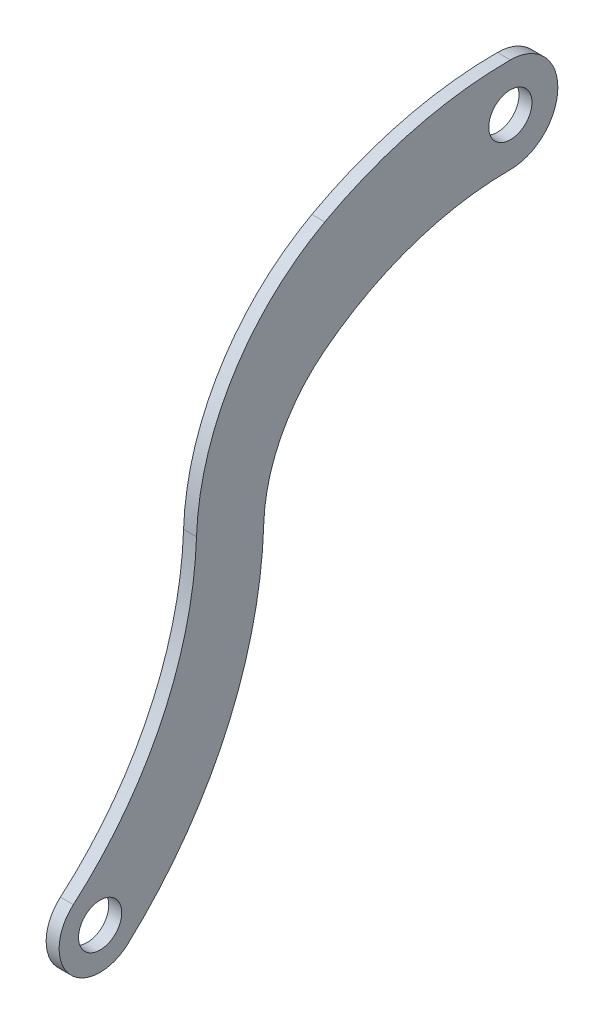
ISO-10303-21;
HEADER;
FILE_DESCRIPTION(('STEP AP214'),'2;1');
FILE_NAME('part.step','',(''),(''),'','','');
FILE_SCHEMA(('AUTOMOTIVE_DESIGN { 1 0 10303 214 1 1 1 1 }'));
ENDSEC;
DATA;
#1=APPLICATION_CONTEXT('core data for automotive mechanical design processes');
#2=APPLICATION_PROTOCOL_DEFINITION('international standard','automotive_design',2000,#1);
#3=PRODUCT_CONTEXT('',#1,'mechanical');
#4=PRODUCT('Part','Part','',(#3));
#5=PRODUCT_RELATED_PRODUCT_CATEGORY('part','',(#4));
#6=PRODUCT_DEFINITION_FORMATION('','',#4);
#7=PRODUCT_DEFINITION_CONTEXT('part definition',#1,'design');
#8=PRODUCT_DEFINITION('design','',#6,#7);
#9=PRODUCT_DEFINITION_SHAPE('','',#8);
#10=(LENGTH_UNIT() NAMED_UNIT(*) SI_UNIT(.MILLI.,.METRE.));
#11=(NAMED_UNIT(*) PLANE_ANGLE_UNIT() SI_UNIT($,.RADIAN.));
#12=(NAMED_UNIT(*) SI_UNIT($,.STERADIAN.) SOLID_ANGLE_UNIT());
#13=UNCERTAINTY_MEASURE_WITH_UNIT(LENGTH_MEASURE(1.E-05),#10,'distance_accuracy_value','');
#14=(GEOMETRIC_REPRESENTATION_CONTEXT(3) GLOBAL_UNCERTAINTY_ASSIGNED_CONTEXT((#13)) GLOBAL_UNIT_ASSIGNED_CONTEXT((#10,
#11,#12)) REPRESENTATION_CONTEXT('',''));
#15=CARTESIAN_POINT('',(0.,0.,0.));
#16=DIRECTION('',(0.,0.,1.));
#17=DIRECTION('',(1.,0.,0.));
#18=AXIS2_PLACEMENT_3D('',#15,#16,#17);
#19=CARTESIAN_POINT('',(1.5,9.00000000000001,0.));
#20=DIRECTION('',(-1.,0.,0.));
#21=DIRECTION('',(0.,0.,1.));
#22=AXIS2_PLACEMENT_3D('',#19,#20,#21);
#23=CYLINDRICAL_SURFACE('',#22,70.);
#24=CARTESIAN_POINT('',(-1.5,9.00000000000001,0.));
#25=DIRECTION('',(-1.,0.,0.));
#26=DIRECTION('',(0.,0.,-1.));
#27=AXIS2_PLACEMENT_3D('',#24,#25,#26);
#28=CIRCLE('',#27,70.);
#29=CARTESIAN_POINT('',(-1.5,64.2633835994058,42.9646183870511));
#30=VERTEX_POINT('',#29);
#31=CARTESIAN_POINT('',(-1.5,79.,0.));
#32=VERTEX_POINT('',#31);
#33=EDGE_CURVE('E133',#30,#32,#28,.T.);
#34=ORIENTED_EDGE('',*,*,#33,.T.);
#35=DIRECTION('',(-1.,0.,0.));
#36=VECTOR('',#35,1.);
#37=CARTESIAN_POINT('',(1.5,79.,0.));
#38=LINE('',#37,#36);
#39=CARTESIAN_POINT('',(1.5,79.,0.));
#40=VERTEX_POINT('',#39);
#41=EDGE_CURVE('E11',#40,#32,#38,.T.);
#42=ORIENTED_EDGE('',*,*,#41,.F.);
#43=CARTESIAN_POINT('',(1.5,9.00000000000001,0.));
#44=DIRECTION('',(-1.,0.,0.));
#45=DIRECTION('',(0.,0.,-1.));
#46=AXIS2_PLACEMENT_3D('',#43,#44,#45);
#47=CIRCLE('',#46,70.);
#48=CARTESIAN_POINT('',(1.5,64.2633835994058,42.9646183870511));
#49=VERTEX_POINT('',#48);
#50=EDGE_CURVE('E148',#49,#40,#47,.T.);
#51=ORIENTED_EDGE('',*,*,#50,.F.);
#52=DIRECTION('',(-1.,0.,0.));
#53=VECTOR('',#52,1.);
#54=CARTESIAN_POINT('',(1.5,64.2633835994058,42.9646183870511));
#55=LINE('',#54,#53);
#56=EDGE_CURVE('E129',#49,#30,#55,.T.);
#57=ORIENTED_EDGE('',*,*,#56,.T.);
#58=EDGE_LOOP('',(#34,#42,#51,#57));
#59=FACE_BOUND('',#58,.T.);
#60=ADVANCED_FACE('F37',(#59),#23,.F.);
#61=CARTESIAN_POINT('',(1.5,90.,0.));
#62=DIRECTION('',(-1.,0.,0.));
#63=DIRECTION('',(0.,0.,1.));
#64=AXIS2_PLACEMENT_3D('',#61,#62,#63);
#65=CYLINDRICAL_SURFACE('',#64,11.);
#66=CARTESIAN_POINT('',(-1.5,90.,0.));
#67=DIRECTION('',(1.,0.,0.));
#68=DIRECTION('',(0.,0.,-1.));
#69=AXIS2_PLACEMENT_3D('',#66,#67,#68);
#70=CIRCLE('',#69,11.);
#71=CARTESIAN_POINT('',(-1.5,101.,0.));
#72=VERTEX_POINT('',#71);
#73=EDGE_CURVE('E136',#32,#72,#70,.T.);
#74=ORIENTED_EDGE('',*,*,#73,.T.);
#75=DIRECTION('',(-1.,0.,0.));
#76=VECTOR('',#75,1.);
#77=CARTESIAN_POINT('',(1.5,101.,0.));
#78=LINE('',#77,#76);
#79=CARTESIAN_POINT('',(1.5,101.,0.));
#80=VERTEX_POINT('',#79);
#81=EDGE_CURVE('E45',#80,#72,#78,.T.);
#82=ORIENTED_EDGE('',*,*,#81,.F.);
#83=CARTESIAN_POINT('',(1.5,90.,0.));
#84=DIRECTION('',(1.,0.,0.));
#85=DIRECTION('',(0.,0.,-1.));
#86=AXIS2_PLACEMENT_3D('',#83,#84,#85);
#87=CIRCLE('',#86,11.);
#88=EDGE_CURVE('E96',#40,#80,#87,.T.);
#89=ORIENTED_EDGE('',*,*,#88,.F.);
#90=ORIENTED_EDGE('',*,*,#41,.T.);
#91=EDGE_LOOP('',(#74,#82,#89,#90));
#92=FACE_BOUND('',#91,.T.);
#93=ADVANCED_FACE('F217',(#92),#65,.T.);
#94=CARTESIAN_POINT('',(1.5,11.5927984934132,2.20309881449055E-13));
#95=DIRECTION('',(-1.,0.,0.));
#96=DIRECTION('',(0.,0.,1.));
#97=AXIS2_PLACEMENT_3D('',#94,#95,#96);
#98=CYLINDRICAL_SURFACE('',#97,89.4072015065867);
#99=CARTESIAN_POINT('',(-1.5,11.5927984934132,2.20309881449055E-13));
#100=DIRECTION('',(1.,0.,0.));
#101=DIRECTION('',(0.,0.,-1.));
#102=AXIS2_PLACEMENT_3D('',#99,#100,#101);
#103=CIRCLE('',#102,89.4072015065867);
#104=CARTESIAN_POINT('',(-1.5,90.,42.9646183870511));
#105=VERTEX_POINT('',#104);
#106=EDGE_CURVE('E139',#72,#105,#103,.T.);
#107=ORIENTED_EDGE('',*,*,#106,.T.);
#108=DIRECTION('',(-1.,0.,0.));
#109=VECTOR('',#108,1.);
#110=CARTESIAN_POINT('',(1.5,90.,42.9646183870511));
#111=LINE('',#110,#109);
#112=CARTESIAN_POINT('',(1.5,90.,42.9646183870511));
#113=VERTEX_POINT('',#112);
#114=EDGE_CURVE('E155',#113,#105,#111,.T.);
#115=ORIENTED_EDGE('',*,*,#114,.F.);
#116=CARTESIAN_POINT('',(1.5,11.5927984934132,2.20309881449055E-13));
#117=DIRECTION('',(1.,0.,0.));
#118=DIRECTION('',(0.,0.,-1.));
#119=AXIS2_PLACEMENT_3D('',#116,#117,#118);
#120=CIRCLE('',#119,89.4072015065867);
#121=EDGE_CURVE('E163',#80,#113,#120,.T.);
#122=ORIENTED_EDGE('',*,*,#121,.F.);
#123=ORIENTED_EDGE('',*,*,#81,.T.);
#124=EDGE_LOOP('',(#107,#115,#122,#123));
#125=FACE_BOUND('',#124,.T.);
#126=ADVANCED_FACE('F161',(#125),#98,.T.);
#127=CARTESIAN_POINT('',(1.5,39.7821868523302,15.4468759263588));
#128=DIRECTION('',(-1.,0.,0.));
#129=DIRECTION('',(0.,0.,1.));
#130=AXIS2_PLACEMENT_3D('',#127,#128,#129);
#131=CYLINDRICAL_SURFACE('',#130,57.2630326429474);
#132=CARTESIAN_POINT('',(-1.5,39.7821868523302,15.4468759263588));
#133=DIRECTION('',(1.,0.,0.));
#134=DIRECTION('',(0.,0.,-1.));
#135=AXIS2_PLACEMENT_3D('',#132,#133,#134);
#136=CIRCLE('',#135,57.2630326429474);
#137=CARTESIAN_POINT('',(-1.5,41.7178430463365,72.6771838284299));
#138=VERTEX_POINT('',#137);
#139=EDGE_CURVE('E141',#105,#138,#136,.T.);
#140=ORIENTED_EDGE('',*,*,#139,.T.);
#141=DIRECTION('',(-1.,0.,0.));
#142=VECTOR('',#141,1.);
#143=CARTESIAN_POINT('',(1.5,41.7178430463365,72.6771838284299));
#144=LINE('',#143,#142);
#145=CARTESIAN_POINT('',(1.5,41.7178430463365,72.6771838284299));
#146=VERTEX_POINT('',#145);
#147=EDGE_CURVE('E152',#146,#138,#144,.T.);
#148=ORIENTED_EDGE('',*,*,#147,.F.);
#149=CARTESIAN_POINT('',(1.5,39.7821868523302,15.4468759263588));
#150=DIRECTION('',(1.,0.,0.));
#151=DIRECTION('',(0.,0.,-1.));
#152=AXIS2_PLACEMENT_3D('',#149,#150,#151);
#153=CIRCLE('',#152,57.2630326429474);
#154=EDGE_CURVE('E175',#113,#146,#153,.T.);
#155=ORIENTED_EDGE('',*,*,#154,.F.);
#156=ORIENTED_EDGE('',*,*,#114,.T.);
#157=EDGE_LOOP('',(#140,#148,#155,#156));
#158=FACE_BOUND('',#157,.T.);
#159=ADVANCED_FACE('F171',(#158),#131,.T.);
#160=CARTESIAN_POINT('',(1.5,44.4967377464635,154.838984983079));
#161=DIRECTION('',(-1.,0.,0.));
#162=DIRECTION('',(0.,0.,1.));
#163=AXIS2_PLACEMENT_3D('',#160,#161,#162);
#164=CYLINDRICAL_SURFACE('',#163,82.2087819197586);
#165=CARTESIAN_POINT('',(-1.5,44.4967377464635,154.838984983079));
#166=DIRECTION('',(-1.,0.,0.));
#167=DIRECTION('',(0.,0.,1.));
#168=AXIS2_PLACEMENT_3D('',#165,#166,#167);
#169=CIRCLE('',#168,82.2087819197586);
#170=CARTESIAN_POINT('',(-1.5,-17.8009183551356,101.198646906429));
#171=VERTEX_POINT('',#170);
#172=EDGE_CURVE('E143',#138,#171,#169,.T.);
#173=ORIENTED_EDGE('',*,*,#172,.T.);
#174=DIRECTION('',(-1.,0.,0.));
#175=VECTOR('',#174,1.);
#176=CARTESIAN_POINT('',(1.5,-17.8009183551356,101.198646906429));
#177=LINE('',#176,#175);
#178=CARTESIAN_POINT('',(1.5,-17.8009183551356,101.198646906429));
#179=VERTEX_POINT('',#178);
#180=EDGE_CURVE('E124',#179,#171,#177,.T.);
#181=ORIENTED_EDGE('',*,*,#180,.F.);
#182=CARTESIAN_POINT('',(1.5,44.4967377464635,154.838984983079));
#183=DIRECTION('',(-1.,0.,0.));
#184=DIRECTION('',(0.,0.,1.));
#185=AXIS2_PLACEMENT_3D('',#182,#183,#184);
#186=CIRCLE('',#185,82.2087819197586);
#187=EDGE_CURVE('E115',#146,#179,#186,.T.);
#188=ORIENTED_EDGE('',*,*,#187,.F.);
#189=ORIENTED_EDGE('',*,*,#147,.T.);
#190=EDGE_LOOP('',(#173,#181,#188,#189));
#191=FACE_BOUND('',#190,.T.);
#192=ADVANCED_FACE('F174',(#191),#164,.F.);
#193=CARTESIAN_POINT('',(1.5,-25.,95.));
#194=DIRECTION('',(-1.,0.,0.));
#195=DIRECTION('',(0.,0.,1.));
#196=AXIS2_PLACEMENT_3D('',#193,#194,#195);
#197=CYLINDRICAL_SURFACE('',#196,9.5);
#198=CARTESIAN_POINT('',(-1.5,-25.,95.));
#199=DIRECTION('',(1.,0.,0.));
#200=DIRECTION('',(0.,0.,-1.));
#201=AXIS2_PLACEMENT_3D('',#198,#199,#200);
#202=CIRCLE('',#201,9.5);
#203=CARTESIAN_POINT('',(-1.5,-32.0126579628157,88.5912069547724));
#204=VERTEX_POINT('',#203);
#205=EDGE_CURVE('E123',#171,#204,#202,.T.);
#206=ORIENTED_EDGE('',*,*,#205,.T.);
#207=DIRECTION('',(-1.,0.,0.));
#208=VECTOR('',#207,1.);
#209=CARTESIAN_POINT('',(1.5,-32.0126579628157,88.5912069547724));
#210=LINE('',#209,#208);
#211=CARTESIAN_POINT('',(1.5,-32.0126579628157,88.5912069547724));
#212=VERTEX_POINT('',#211);
#213=EDGE_CURVE('E120',#212,#204,#210,.T.);
#214=ORIENTED_EDGE('',*,*,#213,.F.);
#215=CARTESIAN_POINT('',(1.5,-25.,95.));
#216=DIRECTION('',(1.,0.,0.));
#217=DIRECTION('',(0.,0.,-1.));
#218=AXIS2_PLACEMENT_3D('',#215,#216,#217);
#219=CIRCLE('',#218,9.5);
#220=EDGE_CURVE('E109',#179,#212,#219,.T.);
#221=ORIENTED_EDGE('',*,*,#220,.F.);
#222=ORIENTED_EDGE('',*,*,#180,.T.);
#223=EDGE_LOOP('',(#206,#214,#221,#222));
#224=FACE_BOUND('',#223,.T.);
#225=ADVANCED_FACE('F121',(#224),#197,.T.);
#226=CARTESIAN_POINT('',(1.5,39.5222221818158,153.966168173903));
#227=DIRECTION('',(-1.,0.,0.));
#228=DIRECTION('',(0.,0.,1.));
#229=AXIS2_PLACEMENT_3D('',#226,#227,#228);
#230=CYLINDRICAL_SURFACE('',#229,96.9078151219476);
#231=CARTESIAN_POINT('',(-1.5,39.5222221818158,153.966168173903));
#232=DIRECTION('',(1.,0.,0.));
#233=DIRECTION('',(0.,0.,1.));
#234=AXIS2_PLACEMENT_3D('',#231,#232,#233);
#235=CIRCLE('',#234,96.9078151219476);
#236=CARTESIAN_POINT('',(-1.5,36.4726904488493,57.1063468447301));
#237=VERTEX_POINT('',#236);
#238=EDGE_CURVE('E82',#204,#237,#235,.T.);
#239=ORIENTED_EDGE('',*,*,#238,.T.);
#240=DIRECTION('',(-1.,0.,0.));
#241=VECTOR('',#240,1.);
#242=CARTESIAN_POINT('',(1.5,36.4726904488493,57.1063468447301));
#243=LINE('',#242,#241);
#244=CARTESIAN_POINT('',(1.5,36.4726904488493,57.1063468447301));
#245=VERTEX_POINT('',#244);
#246=EDGE_CURVE('E125',#245,#237,#243,.T.);
#247=ORIENTED_EDGE('',*,*,#246,.F.);
#248=CARTESIAN_POINT('',(1.5,39.5222221818158,153.966168173903));
#249=DIRECTION('',(1.,0.,0.));
#250=DIRECTION('',(0.,0.,1.));
#251=AXIS2_PLACEMENT_3D('',#248,#249,#250);
#252=CIRCLE('',#251,96.9078151219476);
#253=EDGE_CURVE('E113',#212,#245,#252,.T.);
#254=ORIENTED_EDGE('',*,*,#253,.F.);
#255=ORIENTED_EDGE('',*,*,#213,.T.);
#256=EDGE_LOOP('',(#239,#247,#254,#255));
#257=FACE_BOUND('',#256,.T.);
#258=ADVANCED_FACE('F127',(#257),#230,.T.);
#259=CARTESIAN_POINT('',(1.5,35.3189725230193,20.4617331972944));
#260=DIRECTION('',(-1.,0.,0.));
#261=DIRECTION('',(0.,0.,1.));
#262=AXIS2_PLACEMENT_3D('',#259,#260,#261);
#263=CYLINDRICAL_SURFACE('',#262,36.6627709594108);
#264=CARTESIAN_POINT('',(-1.5,35.3189725230193,20.4617331972944));
#265=DIRECTION('',(-1.,0.,0.));
#266=DIRECTION('',(0.,0.,-1.));
#267=AXIS2_PLACEMENT_3D('',#264,#265,#266);
#268=CIRCLE('',#267,36.6627709594108);
#269=EDGE_CURVE('E88',#237,#30,#268,.T.);
#270=ORIENTED_EDGE('',*,*,#269,.T.);
#271=ORIENTED_EDGE('',*,*,#56,.F.);
#272=CARTESIAN_POINT('',(1.5,35.3189725230193,20.4617331972944));
#273=DIRECTION('',(-1.,0.,0.));
#274=DIRECTION('',(0.,0.,-1.));
#275=AXIS2_PLACEMENT_3D('',#272,#273,#274);
#276=CIRCLE('',#275,36.6627709594108);
#277=EDGE_CURVE('E53',#245,#49,#276,.T.);
#278=ORIENTED_EDGE('',*,*,#277,.F.);
#279=ORIENTED_EDGE('',*,*,#246,.T.);
#280=EDGE_LOOP('',(#270,#271,#278,#279));
#281=FACE_BOUND('',#280,.T.);
#282=ADVANCED_FACE('F204',(#281),#263,.F.);
#283=CARTESIAN_POINT('',(1.5,22.1594862615097,10.2308665986472));
#284=DIRECTION('',(1.,0.,0.));
#285=DIRECTION('',(0.,0.,-1.));
#286=AXIS2_PLACEMENT_3D('',#283,#284,#285);
#287=PLANE('',#286);
#288=CARTESIAN_POINT('',(1.5,90.,0.));
#289=DIRECTION('',(1.,0.,0.));
#290=DIRECTION('',(0.,0.,-1.));
#291=AXIS2_PLACEMENT_3D('',#288,#289,#290);
#292=CIRCLE('',#291,5.);
#293=CARTESIAN_POINT('',(1.5,90.,-5.));
#294=VERTEX_POINT('',#293);
#295=EDGE_CURVE('E187',#294,#294,#292,.T.);
#296=ORIENTED_EDGE('',*,*,#295,.F.);
#297=EDGE_LOOP('',(#296));
#298=FACE_BOUND('',#297,.T.);
#299=CARTESIAN_POINT('',(1.5,-25.,95.));
#300=DIRECTION('',(1.,0.,0.));
#301=DIRECTION('',(0.,0.,-1.));
#302=AXIS2_PLACEMENT_3D('',#299,#300,#301);
#303=CIRCLE('',#302,5.);
#304=CARTESIAN_POINT('',(1.5,-25.,90.));
#305=VERTEX_POINT('',#304);
#306=EDGE_CURVE('E181',#305,#305,#303,.T.);
#307=ORIENTED_EDGE('',*,*,#306,.F.);
#308=EDGE_LOOP('',(#307));
#309=FACE_BOUND('',#308,.T.);
#310=ORIENTED_EDGE('',*,*,#50,.T.);
#311=ORIENTED_EDGE('',*,*,#88,.T.);
#312=ORIENTED_EDGE('',*,*,#121,.T.);
#313=ORIENTED_EDGE('',*,*,#154,.T.);
#314=ORIENTED_EDGE('',*,*,#187,.T.);
#315=ORIENTED_EDGE('',*,*,#220,.T.);
#316=ORIENTED_EDGE('',*,*,#253,.T.);
#317=ORIENTED_EDGE('',*,*,#277,.T.);
#318=EDGE_LOOP('',(#310,#311,#312,#313,#314,#315,#316,#317));
#319=FACE_BOUND('',#318,.T.);
#320=ADVANCED_FACE('F111',(#298,#309,#319),#287,.T.);
#321=CARTESIAN_POINT('',(-1.5,22.1594862615097,10.2308665986472));
#322=DIRECTION('',(1.,0.,0.));
#323=DIRECTION('',(0.,0.,-1.));
#324=AXIS2_PLACEMENT_3D('',#321,#322,#323);
#325=PLANE('',#324);
#326=CARTESIAN_POINT('',(-1.5,90.,0.));
#327=DIRECTION('',(1.,0.,0.));
#328=DIRECTION('',(0.,0.,-1.));
#329=AXIS2_PLACEMENT_3D('',#326,#327,#328);
#330=CIRCLE('',#329,5.);
#331=CARTESIAN_POINT('',(-1.5,90.,-5.));
#332=VERTEX_POINT('',#331);
#333=EDGE_CURVE('E137',#332,#332,#330,.T.);
#334=ORIENTED_EDGE('',*,*,#333,.T.);
#335=EDGE_LOOP('',(#334));
#336=FACE_BOUND('',#335,.T.);
#337=CARTESIAN_POINT('',(-1.5,-25.,95.));
#338=DIRECTION('',(1.,0.,0.));
#339=DIRECTION('',(0.,0.,-1.));
#340=AXIS2_PLACEMENT_3D('',#337,#338,#339);
#341=CIRCLE('',#340,5.);
#342=CARTESIAN_POINT('',(-1.5,-25.,90.));
#343=VERTEX_POINT('',#342);
#344=EDGE_CURVE('E184',#343,#343,#341,.T.);
#345=ORIENTED_EDGE('',*,*,#344,.T.);
#346=EDGE_LOOP('',(#345));
#347=FACE_BOUND('',#346,.T.);
#348=ORIENTED_EDGE('',*,*,#33,.F.);
#349=ORIENTED_EDGE('',*,*,#269,.F.);
#350=ORIENTED_EDGE('',*,*,#238,.F.);
#351=ORIENTED_EDGE('',*,*,#205,.F.);
#352=ORIENTED_EDGE('',*,*,#172,.F.);
#353=ORIENTED_EDGE('',*,*,#139,.F.);
#354=ORIENTED_EDGE('',*,*,#106,.F.);
#355=ORIENTED_EDGE('',*,*,#73,.F.);
#356=EDGE_LOOP('',(#348,#349,#350,#351,#352,#353,#354,#355));
#357=FACE_BOUND('',#356,.T.);
#358=ADVANCED_FACE('F167',(#336,#347,#357),#325,.F.);
#359=CARTESIAN_POINT('',(-1.5,-25.,95.));
#360=DIRECTION('',(1.,0.,0.));
#361=DIRECTION('',(0.,0.,-1.));
#362=AXIS2_PLACEMENT_3D('',#359,#360,#361);
#363=CYLINDRICAL_SURFACE('',#362,5.);
#364=ORIENTED_EDGE('',*,*,#344,.F.);
#365=EDGE_LOOP('',(#364));
#366=FACE_BOUND('',#365,.T.);
#367=ORIENTED_EDGE('',*,*,#306,.T.);
#368=EDGE_LOOP('',(#367));
#369=FACE_BOUND('',#368,.T.);
#370=ADVANCED_FACE('F198',(#366,#369),#363,.F.);
#371=CARTESIAN_POINT('',(-1.5,90.,0.));
#372=DIRECTION('',(1.,0.,0.));
#373=DIRECTION('',(0.,0.,-1.));
#374=AXIS2_PLACEMENT_3D('',#371,#372,#373);
#375=CYLINDRICAL_SURFACE('',#374,5.);
#376=ORIENTED_EDGE('',*,*,#333,.F.);
#377=EDGE_LOOP('',(#376));
#378=FACE_BOUND('',#377,.T.);
#379=ORIENTED_EDGE('',*,*,#295,.T.);
#380=EDGE_LOOP('',(#379));
#381=FACE_BOUND('',#380,.T.);
#382=ADVANCED_FACE('F195',(#378,#381),#375,.F.);
#383=CLOSED_SHELL('',(#60,#93,#126,#159,#192,#225,#258,#282,#320,#358,#370,#382));
#384=MANIFOLD_SOLID_BREP('B2',#383);
#385=ADVANCED_BREP_SHAPE_REPRESENTATION('',(#18,#384),#14);
#386=SHAPE_DEFINITION_REPRESENTATION(#9,#385);
ENDSEC;
END-ISO-10303-21;
